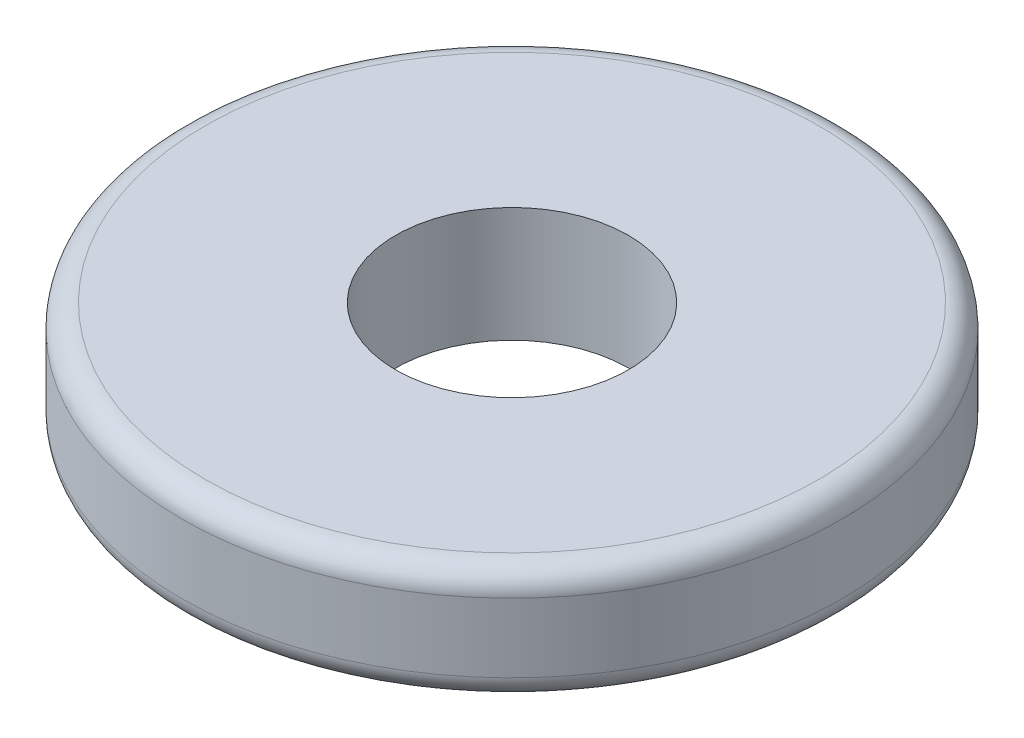
ISO-10303-21;
HEADER;
FILE_DESCRIPTION(('STEP AP214'),'2;1');
FILE_NAME('part.step','',(''),(''),'','','');
FILE_SCHEMA(('AUTOMOTIVE_DESIGN { 1 0 10303 214 1 1 1 1 }'));
ENDSEC;
DATA;
#1=APPLICATION_CONTEXT('core data for automotive mechanical design processes');
#2=APPLICATION_PROTOCOL_DEFINITION('international standard','automotive_design',2000,#1);
#3=PRODUCT_CONTEXT('',#1,'mechanical');
#4=PRODUCT('Part','Part','',(#3));
#5=PRODUCT_RELATED_PRODUCT_CATEGORY('part','',(#4));
#6=PRODUCT_DEFINITION_FORMATION('','',#4);
#7=PRODUCT_DEFINITION_CONTEXT('part definition',#1,'design');
#8=PRODUCT_DEFINITION('design','',#6,#7);
#9=PRODUCT_DEFINITION_SHAPE('','',#8);
#10=(LENGTH_UNIT() NAMED_UNIT(*) SI_UNIT(.MILLI.,.METRE.));
#11=(NAMED_UNIT(*) PLANE_ANGLE_UNIT() SI_UNIT($,.RADIAN.));
#12=(NAMED_UNIT(*) SI_UNIT($,.STERADIAN.) SOLID_ANGLE_UNIT());
#13=UNCERTAINTY_MEASURE_WITH_UNIT(LENGTH_MEASURE(1.E-05),#10,'distance_accuracy_value','');
#14=(GEOMETRIC_REPRESENTATION_CONTEXT(3) GLOBAL_UNCERTAINTY_ASSIGNED_CONTEXT((#13)) GLOBAL_UNIT_ASSIGNED_CONTEXT((#10,
#11,#12)) REPRESENTATION_CONTEXT('',''));
#15=CARTESIAN_POINT('',(0.,0.,0.));
#16=DIRECTION('',(0.,0.,1.));
#17=DIRECTION('',(1.,0.,0.));
#18=AXIS2_PLACEMENT_3D('',#15,#16,#17);
#19=CARTESIAN_POINT('',(0.,1.5,0.));
#20=DIRECTION('',(0.,1.,0.));
#21=DIRECTION('',(0.,0.,1.));
#22=AXIS2_PLACEMENT_3D('',#19,#20,#21);
#23=PLANE('',#22);
#24=CARTESIAN_POINT('',(0.,1.5,0.));
#25=DIRECTION('',(0.,1.,0.));
#26=DIRECTION('',(0.,0.,1.));
#27=AXIS2_PLACEMENT_3D('',#24,#25,#26);
#28=CIRCLE('',#27,4.);
#29=CARTESIAN_POINT('',(0.,1.5,4.));
#30=VERTEX_POINT('',#29);
#31=EDGE_CURVE('E11',#30,#30,#28,.T.);
#32=ORIENTED_EDGE('',*,*,#31,.T.);
#33=EDGE_LOOP('',(#32));
#34=FACE_BOUND('',#33,.T.);
#35=CARTESIAN_POINT('',(0.,1.5,0.));
#36=DIRECTION('',(0.,1.,0.));
#37=DIRECTION('',(0.,0.,1.));
#38=AXIS2_PLACEMENT_3D('',#35,#36,#37);
#39=CIRCLE('',#38,1.52);
#40=CARTESIAN_POINT('',(0.,1.5,1.52));
#41=VERTEX_POINT('',#40);
#42=EDGE_CURVE('E71',#41,#41,#39,.T.);
#43=ORIENTED_EDGE('',*,*,#42,.F.);
#44=EDGE_LOOP('',(#43));
#45=FACE_BOUND('',#44,.T.);
#46=ADVANCED_FACE('F47',(#34,#45),#23,.T.);
#47=CARTESIAN_POINT('',(0.,0.,0.));
#48=DIRECTION('',(0.,1.,0.));
#49=DIRECTION('',(0.,0.,1.));
#50=AXIS2_PLACEMENT_3D('',#47,#48,#49);
#51=PLANE('',#50);
#52=CARTESIAN_POINT('',(0.,0.,0.));
#53=DIRECTION('',(0.,1.,0.));
#54=DIRECTION('',(0.,0.,1.));
#55=AXIS2_PLACEMENT_3D('',#52,#53,#54);
#56=CIRCLE('',#55,4.);
#57=CARTESIAN_POINT('',(0.,0.,4.));
#58=VERTEX_POINT('',#57);
#59=EDGE_CURVE('E55',#58,#58,#56,.F.);
#60=ORIENTED_EDGE('',*,*,#59,.T.);
#61=EDGE_LOOP('',(#60));
#62=FACE_BOUND('',#61,.T.);
#63=CARTESIAN_POINT('',(0.,0.,0.));
#64=DIRECTION('',(0.,1.,0.));
#65=DIRECTION('',(0.,0.,1.));
#66=AXIS2_PLACEMENT_3D('',#63,#64,#65);
#67=CIRCLE('',#66,1.52);
#68=CARTESIAN_POINT('',(0.,0.,1.52));
#69=VERTEX_POINT('',#68);
#70=EDGE_CURVE('E72',#69,#69,#67,.T.);
#71=ORIENTED_EDGE('',*,*,#70,.T.);
#72=EDGE_LOOP('',(#71));
#73=FACE_BOUND('',#72,.T.);
#74=ADVANCED_FACE('F84',(#62,#73),#51,.F.);
#75=CARTESIAN_POINT('',(0.,1.5,0.));
#76=DIRECTION('',(0.,-1.,0.));
#77=DIRECTION('',(0.,0.,-1.));
#78=AXIS2_PLACEMENT_3D('',#75,#76,#77);
#79=CYLINDRICAL_SURFACE('',#78,4.3);
#80=CARTESIAN_POINT('',(0.,0.3,0.));
#81=DIRECTION('',(0.,1.,0.));
#82=DIRECTION('',(0.,0.,1.));
#83=AXIS2_PLACEMENT_3D('',#80,#81,#82);
#84=CIRCLE('',#83,4.3);
#85=CARTESIAN_POINT('',(0.,0.3,4.3));
#86=VERTEX_POINT('',#85);
#87=EDGE_CURVE('E60',#86,#86,#84,.T.);
#88=ORIENTED_EDGE('',*,*,#87,.T.);
#89=EDGE_LOOP('',(#88));
#90=FACE_BOUND('',#89,.T.);
#91=CARTESIAN_POINT('',(0.,1.2,0.));
#92=DIRECTION('',(0.,1.,0.));
#93=DIRECTION('',(0.,0.,1.));
#94=AXIS2_PLACEMENT_3D('',#91,#92,#93);
#95=CIRCLE('',#94,4.3);
#96=CARTESIAN_POINT('',(0.,1.2,4.3));
#97=VERTEX_POINT('',#96);
#98=EDGE_CURVE('E65',#97,#97,#95,.F.);
#99=ORIENTED_EDGE('',*,*,#98,.T.);
#100=EDGE_LOOP('',(#99));
#101=FACE_BOUND('',#100,.T.);
#102=ADVANCED_FACE('F89',(#90,#101),#79,.T.);
#103=CARTESIAN_POINT('',(0.,1.5,0.));
#104=DIRECTION('',(0.,-1.,0.));
#105=DIRECTION('',(0.,0.,-1.));
#106=AXIS2_PLACEMENT_3D('',#103,#104,#105);
#107=CYLINDRICAL_SURFACE('',#106,1.52);
#108=ORIENTED_EDGE('',*,*,#42,.T.);
#109=EDGE_LOOP('',(#108));
#110=FACE_BOUND('',#109,.T.);
#111=ORIENTED_EDGE('',*,*,#70,.F.);
#112=EDGE_LOOP('',(#111));
#113=FACE_BOUND('',#112,.T.);
#114=ADVANCED_FACE('F80',(#110,#113),#107,.F.);
#115=CARTESIAN_POINT('',(0.,0.3,0.));
#116=DIRECTION('',(0.,1.,0.));
#117=DIRECTION('',(0.,0.,1.));
#118=AXIS2_PLACEMENT_3D('',#115,#116,#117);
#119=TOROIDAL_SURFACE('',#118,4.,0.3);
#120=ORIENTED_EDGE('',*,*,#59,.F.);
#121=EDGE_LOOP('',(#120));
#122=FACE_BOUND('',#121,.T.);
#123=ORIENTED_EDGE('',*,*,#87,.F.);
#124=EDGE_LOOP('',(#123));
#125=FACE_BOUND('',#124,.T.);
#126=ADVANCED_FACE('F95',(#122,#125),#119,.T.);
#127=CARTESIAN_POINT('',(0.,1.2,0.));
#128=DIRECTION('',(0.,1.,0.));
#129=DIRECTION('',(0.,0.,1.));
#130=AXIS2_PLACEMENT_3D('',#127,#128,#129);
#131=TOROIDAL_SURFACE('',#130,4.,0.3);
#132=ORIENTED_EDGE('',*,*,#98,.F.);
#133=EDGE_LOOP('',(#132));
#134=FACE_BOUND('',#133,.T.);
#135=ORIENTED_EDGE('',*,*,#31,.F.);
#136=EDGE_LOOP('',(#135));
#137=FACE_BOUND('',#136,.T.);
#138=ADVANCED_FACE('F49',(#134,#137),#131,.T.);
#139=CLOSED_SHELL('',(#46,#74,#102,#114,#126,#138));
#140=MANIFOLD_SOLID_BREP('B2',#139);
#141=ADVANCED_BREP_SHAPE_REPRESENTATION('',(#18,#140),#14);
#142=SHAPE_DEFINITION_REPRESENTATION(#9,#141);
ENDSEC;
END-ISO-10303-21;
